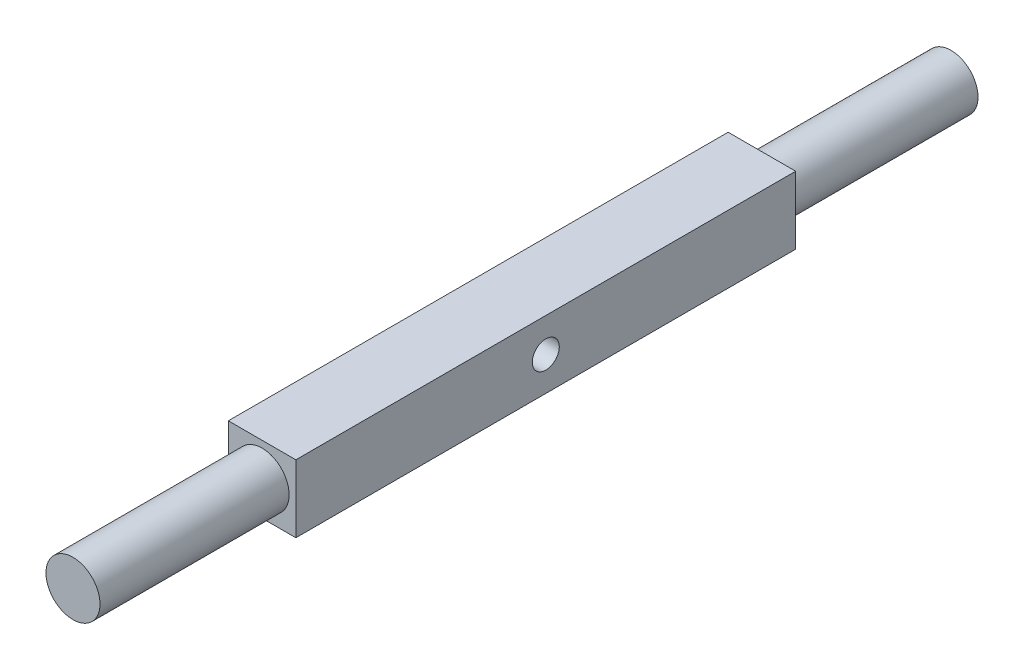
ISO-10303-21;
HEADER;
FILE_DESCRIPTION(('STEP AP214'),'2;1');
FILE_NAME('part.step','',(''),(''),'','','');
FILE_SCHEMA(('AUTOMOTIVE_DESIGN { 1 0 10303 214 1 1 1 1 }'));
ENDSEC;
DATA;
#1=APPLICATION_CONTEXT('core data for automotive mechanical design processes');
#2=APPLICATION_PROTOCOL_DEFINITION('international standard','automotive_design',2000,#1);
#3=PRODUCT_CONTEXT('',#1,'mechanical');
#4=PRODUCT('Part','Part','',(#3));
#5=PRODUCT_RELATED_PRODUCT_CATEGORY('part','',(#4));
#6=PRODUCT_DEFINITION_FORMATION('','',#4);
#7=PRODUCT_DEFINITION_CONTEXT('part definition',#1,'design');
#8=PRODUCT_DEFINITION('design','',#6,#7);
#9=PRODUCT_DEFINITION_SHAPE('','',#8);
#10=(LENGTH_UNIT() NAMED_UNIT(*) SI_UNIT(.MILLI.,.METRE.));
#11=(NAMED_UNIT(*) PLANE_ANGLE_UNIT() SI_UNIT($,.RADIAN.));
#12=(NAMED_UNIT(*) SI_UNIT($,.STERADIAN.) SOLID_ANGLE_UNIT());
#13=UNCERTAINTY_MEASURE_WITH_UNIT(LENGTH_MEASURE(1.E-05),#10,'distance_accuracy_value','');
#14=(GEOMETRIC_REPRESENTATION_CONTEXT(3) GLOBAL_UNCERTAINTY_ASSIGNED_CONTEXT((#13)) GLOBAL_UNIT_ASSIGNED_CONTEXT((#10,
#11,#12)) REPRESENTATION_CONTEXT('',''));
#15=CARTESIAN_POINT('',(0.,0.,0.));
#16=DIRECTION('',(0.,0.,1.));
#17=DIRECTION('',(1.,0.,0.));
#18=AXIS2_PLACEMENT_3D('',#15,#16,#17);
#19=CARTESIAN_POINT('',(-4.44089209850063E-13,24.9999999999999,-92.4999999999999));
#20=DIRECTION('',(-1.00000000000001,0.,0.));
#21=DIRECTION('',(0.,0.,1.));
#22=AXIS2_PLACEMENT_3D('',#19,#20,#21);
#23=PLANE('',#22);
#24=CARTESIAN_POINT('',(-2.22044604925031E-13,12.5000000000002,0.));
#25=DIRECTION('',(1.00000000000001,0.,0.));
#26=DIRECTION('',(0.,0.,-1.));
#27=AXIS2_PLACEMENT_3D('',#24,#25,#26);
#28=CIRCLE('',#27,5.);
#29=CARTESIAN_POINT('',(-2.22044604925031E-13,12.5000000000002,-5.));
#30=VERTEX_POINT('',#29);
#31=EDGE_CURVE('E103',#30,#30,#28,.T.);
#32=ORIENTED_EDGE('',*,*,#31,.T.);
#33=EDGE_LOOP('',(#32));
#34=FACE_BOUND('',#33,.T.);
#35=DIRECTION('',(0.,0.,1.));
#36=VECTOR('',#35,1.);
#37=CARTESIAN_POINT('',(0.,0.,-92.4999999999999));
#38=LINE('',#37,#36);
#39=CARTESIAN_POINT('',(0.,0.,-92.4999999999999));
#40=VERTEX_POINT('',#39);
#41=CARTESIAN_POINT('',(0.,0.,92.5));
#42=VERTEX_POINT('',#41);
#43=EDGE_CURVE('E46',#40,#42,#38,.T.);
#44=ORIENTED_EDGE('',*,*,#43,.T.);
#45=DIRECTION('',(0.,-1.00000000000001,0.));
#46=VECTOR('',#45,1.);
#47=CARTESIAN_POINT('',(-4.44089209850063E-13,24.9999999999999,92.5));
#48=LINE('',#47,#46);
#49=CARTESIAN_POINT('',(-4.44089209850063E-13,24.9999999999999,92.5));
#50=VERTEX_POINT('',#49);
#51=EDGE_CURVE('E86',#50,#42,#48,.T.);
#52=ORIENTED_EDGE('',*,*,#51,.F.);
#53=DIRECTION('',(0.,0.,1.));
#54=VECTOR('',#53,1.);
#55=CARTESIAN_POINT('',(-4.44089209850063E-13,24.9999999999999,-92.4999999999999));
#56=LINE('',#55,#54);
#57=CARTESIAN_POINT('',(-4.44089209850063E-13,24.9999999999999,-92.4999999999999));
#58=VERTEX_POINT('',#57);
#59=EDGE_CURVE('E59',#58,#50,#56,.T.);
#60=ORIENTED_EDGE('',*,*,#59,.F.);
#61=DIRECTION('',(0.,-1.00000000000001,0.));
#62=VECTOR('',#61,1.);
#63=CARTESIAN_POINT('',(-4.44089209850063E-13,24.9999999999999,-92.4999999999999));
#64=LINE('',#63,#62);
#65=EDGE_CURVE('E87',#58,#40,#64,.T.);
#66=ORIENTED_EDGE('',*,*,#65,.T.);
#67=EDGE_LOOP('',(#44,#52,#60,#66));
#68=FACE_BOUND('',#67,.T.);
#69=ADVANCED_FACE('F43',(#34,#68),#23,.T.);
#70=CARTESIAN_POINT('',(24.9999999999999,24.9999999999999,-92.4999999999999));
#71=DIRECTION('',(0.,1.00000000000001,0.));
#72=DIRECTION('',(0.,0.,1.));
#73=AXIS2_PLACEMENT_3D('',#70,#71,#72);
#74=PLANE('',#73);
#75=ORIENTED_EDGE('',*,*,#59,.T.);
#76=DIRECTION('',(-1.00000000000001,0.,0.));
#77=VECTOR('',#76,1.);
#78=CARTESIAN_POINT('',(24.9999999999999,24.9999999999999,92.5));
#79=LINE('',#78,#77);
#80=CARTESIAN_POINT('',(24.9999999999999,24.9999999999999,92.5));
#81=VERTEX_POINT('',#80);
#82=EDGE_CURVE('E102',#81,#50,#79,.T.);
#83=ORIENTED_EDGE('',*,*,#82,.F.);
#84=DIRECTION('',(0.,0.,1.));
#85=VECTOR('',#84,1.);
#86=CARTESIAN_POINT('',(24.9999999999999,24.9999999999999,-92.4999999999999));
#87=LINE('',#86,#85);
#88=CARTESIAN_POINT('',(24.9999999999999,24.9999999999999,-92.4999999999999));
#89=VERTEX_POINT('',#88);
#90=EDGE_CURVE('E67',#89,#81,#87,.T.);
#91=ORIENTED_EDGE('',*,*,#90,.F.);
#92=DIRECTION('',(-1.00000000000001,0.,0.));
#93=VECTOR('',#92,1.);
#94=CARTESIAN_POINT('',(24.9999999999999,24.9999999999999,-92.4999999999999));
#95=LINE('',#94,#93);
#96=EDGE_CURVE('E92',#89,#58,#95,.T.);
#97=ORIENTED_EDGE('',*,*,#96,.T.);
#98=EDGE_LOOP('',(#75,#83,#91,#97));
#99=FACE_BOUND('',#98,.T.);
#100=ADVANCED_FACE('F127',(#99),#74,.T.);
#101=CARTESIAN_POINT('',(24.9999999999999,0.,-92.4999999999999));
#102=DIRECTION('',(1.00000000000001,0.,0.));
#103=DIRECTION('',(0.,0.,-1.));
#104=AXIS2_PLACEMENT_3D('',#101,#102,#103);
#105=PLANE('',#104);
#106=CARTESIAN_POINT('',(24.9999999999999,12.5000000000002,0.));
#107=DIRECTION('',(1.00000000000001,0.,0.));
#108=DIRECTION('',(0.,0.,-1.));
#109=AXIS2_PLACEMENT_3D('',#106,#107,#108);
#110=CIRCLE('',#109,5.);
#111=CARTESIAN_POINT('',(24.9999999999999,12.5000000000002,-5.));
#112=VERTEX_POINT('',#111);
#113=EDGE_CURVE('E106',#112,#112,#110,.T.);
#114=ORIENTED_EDGE('',*,*,#113,.F.);
#115=EDGE_LOOP('',(#114));
#116=FACE_BOUND('',#115,.T.);
#117=ORIENTED_EDGE('',*,*,#90,.T.);
#118=DIRECTION('',(0.,1.00000000000001,0.));
#119=VECTOR('',#118,1.);
#120=CARTESIAN_POINT('',(24.9999999999999,0.,92.5));
#121=LINE('',#120,#119);
#122=CARTESIAN_POINT('',(24.9999999999999,0.,92.5));
#123=VERTEX_POINT('',#122);
#124=EDGE_CURVE('E99',#123,#81,#121,.T.);
#125=ORIENTED_EDGE('',*,*,#124,.F.);
#126=DIRECTION('',(0.,0.,1.));
#127=VECTOR('',#126,1.);
#128=CARTESIAN_POINT('',(24.9999999999999,0.,-92.4999999999999));
#129=LINE('',#128,#127);
#130=CARTESIAN_POINT('',(24.9999999999999,0.,-92.4999999999999));
#131=VERTEX_POINT('',#130);
#132=EDGE_CURVE('E91',#131,#123,#129,.T.);
#133=ORIENTED_EDGE('',*,*,#132,.F.);
#134=DIRECTION('',(0.,1.00000000000001,0.));
#135=VECTOR('',#134,1.);
#136=CARTESIAN_POINT('',(24.9999999999999,0.,-92.4999999999999));
#137=LINE('',#136,#135);
#138=EDGE_CURVE('E120',#131,#89,#137,.T.);
#139=ORIENTED_EDGE('',*,*,#138,.T.);
#140=EDGE_LOOP('',(#117,#125,#133,#139));
#141=FACE_BOUND('',#140,.T.);
#142=ADVANCED_FACE('F124',(#116,#141),#105,.T.);
#143=CARTESIAN_POINT('',(0.,0.,-92.4999999999999));
#144=DIRECTION('',(0.,-1.00000000000001,0.));
#145=DIRECTION('',(0.,0.,-1.));
#146=AXIS2_PLACEMENT_3D('',#143,#144,#145);
#147=PLANE('',#146);
#148=ORIENTED_EDGE('',*,*,#132,.T.);
#149=DIRECTION('',(1.00000000000001,0.,0.));
#150=VECTOR('',#149,1.);
#151=CARTESIAN_POINT('',(0.,0.,92.5));
#152=LINE('',#151,#150);
#153=EDGE_CURVE('E94',#42,#123,#152,.T.);
#154=ORIENTED_EDGE('',*,*,#153,.F.);
#155=ORIENTED_EDGE('',*,*,#43,.F.);
#156=DIRECTION('',(1.00000000000001,0.,0.));
#157=VECTOR('',#156,1.);
#158=CARTESIAN_POINT('',(0.,0.,-92.4999999999999));
#159=LINE('',#158,#157);
#160=EDGE_CURVE('E128',#40,#131,#159,.T.);
#161=ORIENTED_EDGE('',*,*,#160,.T.);
#162=EDGE_LOOP('',(#148,#154,#155,#161));
#163=FACE_BOUND('',#162,.T.);
#164=ADVANCED_FACE('F95',(#163),#147,.T.);
#165=CARTESIAN_POINT('',(0.,0.,-92.4999999999999));
#166=DIRECTION('',(0.,0.,1.));
#167=DIRECTION('',(1.00000000000001,0.,0.));
#168=AXIS2_PLACEMENT_3D('',#165,#166,#167);
#169=PLANE('',#168);
#170=CARTESIAN_POINT('',(12.5,12.5000000000002,-92.4999999999999));
#171=DIRECTION('',(0.,0.,-1.));
#172=DIRECTION('',(-1.00000000000001,0.,0.));
#173=AXIS2_PLACEMENT_3D('',#170,#171,#172);
#174=CIRCLE('',#173,10.);
#175=CARTESIAN_POINT('',(2.49999999999983,12.5000000000002,-92.4999999999999));
#176=VERTEX_POINT('',#175);
#177=EDGE_CURVE('E12',#176,#176,#174,.T.);
#178=ORIENTED_EDGE('',*,*,#177,.F.);
#179=EDGE_LOOP('',(#178));
#180=FACE_BOUND('',#179,.T.);
#181=ORIENTED_EDGE('',*,*,#65,.F.);
#182=ORIENTED_EDGE('',*,*,#96,.F.);
#183=ORIENTED_EDGE('',*,*,#138,.F.);
#184=ORIENTED_EDGE('',*,*,#160,.F.);
#185=EDGE_LOOP('',(#181,#182,#183,#184));
#186=FACE_BOUND('',#185,.T.);
#187=ADVANCED_FACE('F131',(#180,#186),#169,.F.);
#188=CARTESIAN_POINT('',(0.,0.,92.5));
#189=DIRECTION('',(0.,0.,1.));
#190=DIRECTION('',(1.00000000000001,0.,0.));
#191=AXIS2_PLACEMENT_3D('',#188,#189,#190);
#192=PLANE('',#191);
#193=CARTESIAN_POINT('',(12.5,12.5000000000002,92.5));
#194=DIRECTION('',(0.,0.,1.));
#195=DIRECTION('',(1.00000000000001,0.,0.));
#196=AXIS2_PLACEMENT_3D('',#193,#194,#195);
#197=CIRCLE('',#196,10.);
#198=CARTESIAN_POINT('',(22.5000000000001,12.5000000000002,92.5));
#199=VERTEX_POINT('',#198);
#200=EDGE_CURVE('E51',#199,#199,#197,.T.);
#201=ORIENTED_EDGE('',*,*,#200,.F.);
#202=EDGE_LOOP('',(#201));
#203=FACE_BOUND('',#202,.T.);
#204=ORIENTED_EDGE('',*,*,#51,.T.);
#205=ORIENTED_EDGE('',*,*,#153,.T.);
#206=ORIENTED_EDGE('',*,*,#124,.T.);
#207=ORIENTED_EDGE('',*,*,#82,.T.);
#208=EDGE_LOOP('',(#204,#205,#206,#207));
#209=FACE_BOUND('',#208,.T.);
#210=ADVANCED_FACE('F101',(#203,#209),#192,.T.);
#211=CARTESIAN_POINT('',(-2.22044604925031E-13,12.5000000000002,0.));
#212=DIRECTION('',(1.00000000000001,0.,0.));
#213=DIRECTION('',(0.,0.,-1.));
#214=AXIS2_PLACEMENT_3D('',#211,#212,#213);
#215=CYLINDRICAL_SURFACE('',#214,5.);
#216=ORIENTED_EDGE('',*,*,#31,.F.);
#217=EDGE_LOOP('',(#216));
#218=FACE_BOUND('',#217,.T.);
#219=ORIENTED_EDGE('',*,*,#113,.T.);
#220=EDGE_LOOP('',(#219));
#221=FACE_BOUND('',#220,.T.);
#222=ADVANCED_FACE('F139',(#218,#221),#215,.F.);
#223=CARTESIAN_POINT('',(12.4999999999993,12.4999999999991,162.499999999999));
#224=DIRECTION('',(0.,0.,-1.));
#225=DIRECTION('',(-1.00000000000001,0.,0.));
#226=AXIS2_PLACEMENT_3D('',#223,#224,#225);
#227=CYLINDRICAL_SURFACE('',#226,10.);
#228=CARTESIAN_POINT('',(12.4999999999993,12.4999999999991,162.499999999999));
#229=DIRECTION('',(0.,0.,1.));
#230=DIRECTION('',(1.00000000000001,0.,0.));
#231=AXIS2_PLACEMENT_3D('',#228,#229,#230);
#232=CIRCLE('',#231,10.);
#233=CARTESIAN_POINT('',(22.4999999999994,12.4999999999991,162.499999999999));
#234=VERTEX_POINT('',#233);
#235=EDGE_CURVE('E158',#234,#234,#232,.T.);
#236=ORIENTED_EDGE('',*,*,#235,.F.);
#237=EDGE_LOOP('',(#236));
#238=FACE_BOUND('',#237,.T.);
#239=ORIENTED_EDGE('',*,*,#200,.T.);
#240=EDGE_LOOP('',(#239));
#241=FACE_BOUND('',#240,.T.);
#242=ADVANCED_FACE('F153',(#238,#241),#227,.T.);
#243=CARTESIAN_POINT('',(0.,0.,162.499999999999));
#244=DIRECTION('',(0.,0.,1.));
#245=DIRECTION('',(1.00000000000001,0.,0.));
#246=AXIS2_PLACEMENT_3D('',#243,#244,#245);
#247=PLANE('',#246);
#248=ORIENTED_EDGE('',*,*,#235,.T.);
#249=EDGE_LOOP('',(#248));
#250=FACE_BOUND('',#249,.T.);
#251=ADVANCED_FACE('F171',(#250),#247,.T.);
#252=CARTESIAN_POINT('',(12.4999999999993,12.5000000000002,-162.5));
#253=DIRECTION('',(0.,0.,1.));
#254=DIRECTION('',(1.00000000000001,0.,0.));
#255=AXIS2_PLACEMENT_3D('',#252,#253,#254);
#256=CYLINDRICAL_SURFACE('',#255,10.);
#257=CARTESIAN_POINT('',(12.4999999999993,12.5000000000002,-162.5));
#258=DIRECTION('',(0.,0.,-1.));
#259=DIRECTION('',(-1.00000000000001,0.,0.));
#260=AXIS2_PLACEMENT_3D('',#257,#258,#259);
#261=CIRCLE('',#260,10.);
#262=CARTESIAN_POINT('',(2.49999999999917,12.5000000000002,-162.5));
#263=VERTEX_POINT('',#262);
#264=EDGE_CURVE('E160',#263,#263,#261,.T.);
#265=ORIENTED_EDGE('',*,*,#264,.F.);
#266=EDGE_LOOP('',(#265));
#267=FACE_BOUND('',#266,.T.);
#268=ORIENTED_EDGE('',*,*,#177,.T.);
#269=EDGE_LOOP('',(#268));
#270=FACE_BOUND('',#269,.T.);
#271=ADVANCED_FACE('F177',(#267,#270),#256,.T.);
#272=CARTESIAN_POINT('',(0.,0.,-162.5));
#273=DIRECTION('',(0.,0.,-1.));
#274=DIRECTION('',(-1.00000000000001,0.,0.));
#275=AXIS2_PLACEMENT_3D('',#272,#273,#274);
#276=PLANE('',#275);
#277=ORIENTED_EDGE('',*,*,#264,.T.);
#278=EDGE_LOOP('',(#277));
#279=FACE_BOUND('',#278,.T.);
#280=ADVANCED_FACE('F182',(#279),#276,.T.);
#281=CLOSED_SHELL('',(#69,#100,#142,#164,#187,#210,#222,#242,#251,#271,#280));
#282=MANIFOLD_SOLID_BREP('B2',#281);
#283=ADVANCED_BREP_SHAPE_REPRESENTATION('',(#18,#282),#14);
#284=SHAPE_DEFINITION_REPRESENTATION(#9,#283);
ENDSEC;
END-ISO-10303-21;
